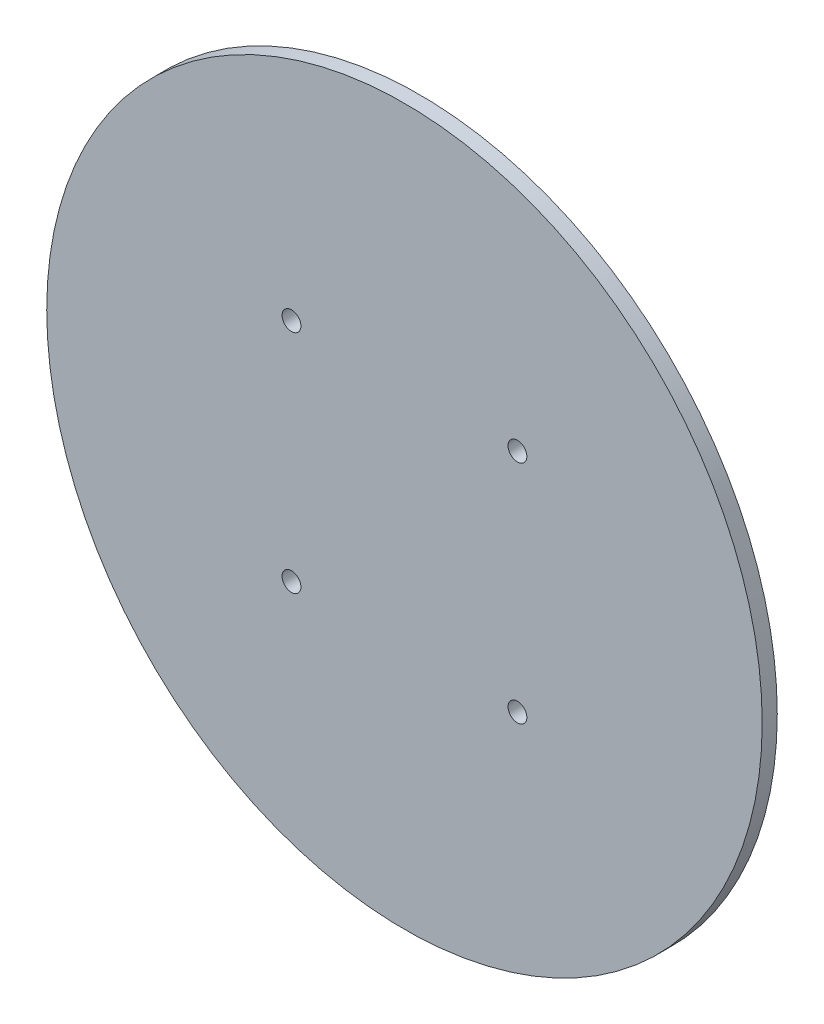
ISO-10303-21;
HEADER;
FILE_DESCRIPTION(('STEP AP214'),'2;1');
FILE_NAME('part.step','',(''),(''),'','','');
FILE_SCHEMA(('AUTOMOTIVE_DESIGN { 1 0 10303 214 1 1 1 1 }'));
ENDSEC;
DATA;
#1=APPLICATION_CONTEXT('core data for automotive mechanical design processes');
#2=APPLICATION_PROTOCOL_DEFINITION('international standard','automotive_design',2000,#1);
#3=PRODUCT_CONTEXT('',#1,'mechanical');
#4=PRODUCT('Part','Part','',(#3));
#5=PRODUCT_RELATED_PRODUCT_CATEGORY('part','',(#4));
#6=PRODUCT_DEFINITION_FORMATION('','',#4);
#7=PRODUCT_DEFINITION_CONTEXT('part definition',#1,'design');
#8=PRODUCT_DEFINITION('design','',#6,#7);
#9=PRODUCT_DEFINITION_SHAPE('','',#8);
#10=(LENGTH_UNIT() NAMED_UNIT(*) SI_UNIT(.MILLI.,.METRE.));
#11=(NAMED_UNIT(*) PLANE_ANGLE_UNIT() SI_UNIT($,.RADIAN.));
#12=(NAMED_UNIT(*) SI_UNIT($,.STERADIAN.) SOLID_ANGLE_UNIT());
#13=UNCERTAINTY_MEASURE_WITH_UNIT(LENGTH_MEASURE(1.E-05),#10,'distance_accuracy_value','');
#14=(GEOMETRIC_REPRESENTATION_CONTEXT(3) GLOBAL_UNCERTAINTY_ASSIGNED_CONTEXT((#13)) GLOBAL_UNIT_ASSIGNED_CONTEXT((#10,
#11,#12)) REPRESENTATION_CONTEXT('',''));
#15=CARTESIAN_POINT('',(0.,0.,0.));
#16=DIRECTION('',(0.,0.,1.));
#17=DIRECTION('',(1.,0.,0.));
#18=AXIS2_PLACEMENT_3D('',#15,#16,#17);
#19=CARTESIAN_POINT('',(0.,0.,4.));
#20=DIRECTION('',(0.,0.,-1.));
#21=DIRECTION('',(-1.,0.,0.));
#22=AXIS2_PLACEMENT_3D('',#19,#20,#21);
#23=CYLINDRICAL_SURFACE('',#22,95.);
#24=CARTESIAN_POINT('',(0.,0.,4.));
#25=DIRECTION('',(0.,0.,1.));
#26=DIRECTION('',(1.,0.,0.));
#27=AXIS2_PLACEMENT_3D('',#24,#25,#26);
#28=CIRCLE('',#27,95.);
#29=CARTESIAN_POINT('',(95.,0.,4.));
#30=VERTEX_POINT('',#29);
#31=EDGE_CURVE('E10',#30,#30,#28,.T.);
#32=ORIENTED_EDGE('',*,*,#31,.F.);
#33=EDGE_LOOP('',(#32));
#34=FACE_BOUND('',#33,.T.);
#35=CARTESIAN_POINT('',(0.,0.,0.));
#36=DIRECTION('',(0.,0.,1.));
#37=DIRECTION('',(1.,0.,0.));
#38=AXIS2_PLACEMENT_3D('',#35,#36,#37);
#39=CIRCLE('',#38,95.);
#40=CARTESIAN_POINT('',(95.,0.,0.));
#41=VERTEX_POINT('',#40);
#42=EDGE_CURVE('E45',#41,#41,#39,.T.);
#43=ORIENTED_EDGE('',*,*,#42,.T.);
#44=EDGE_LOOP('',(#43));
#45=FACE_BOUND('',#44,.T.);
#46=ADVANCED_FACE('F42',(#34,#45),#23,.T.);
#47=CARTESIAN_POINT('',(0.,0.,4.));
#48=DIRECTION('',(0.,0.,1.));
#49=DIRECTION('',(1.,0.,0.));
#50=AXIS2_PLACEMENT_3D('',#47,#48,#49);
#51=PLANE('',#50);
#52=CARTESIAN_POINT('',(30.,30.,4.));
#53=DIRECTION('',(0.,0.,1.));
#54=DIRECTION('',(1.,0.,0.));
#55=AXIS2_PLACEMENT_3D('',#52,#53,#54);
#56=CIRCLE('',#55,2.5);
#57=CARTESIAN_POINT('',(32.5,30.,4.));
#58=VERTEX_POINT('',#57);
#59=EDGE_CURVE('E60',#58,#58,#56,.T.);
#60=ORIENTED_EDGE('',*,*,#59,.F.);
#61=EDGE_LOOP('',(#60));
#62=FACE_BOUND('',#61,.T.);
#63=CARTESIAN_POINT('',(-30.,-30.,4.));
#64=DIRECTION('',(0.,0.,1.));
#65=DIRECTION('',(1.,0.,0.));
#66=AXIS2_PLACEMENT_3D('',#63,#64,#65);
#67=CIRCLE('',#66,2.5);
#68=CARTESIAN_POINT('',(-27.5,-30.,4.));
#69=VERTEX_POINT('',#68);
#70=EDGE_CURVE('E68',#69,#69,#67,.T.);
#71=ORIENTED_EDGE('',*,*,#70,.F.);
#72=EDGE_LOOP('',(#71));
#73=FACE_BOUND('',#72,.T.);
#74=CARTESIAN_POINT('',(30.,-30.,4.));
#75=DIRECTION('',(0.,0.,1.));
#76=DIRECTION('',(1.,0.,0.));
#77=AXIS2_PLACEMENT_3D('',#74,#75,#76);
#78=CIRCLE('',#77,2.5);
#79=CARTESIAN_POINT('',(32.5,-30.,4.));
#80=VERTEX_POINT('',#79);
#81=EDGE_CURVE('E69',#80,#80,#78,.T.);
#82=ORIENTED_EDGE('',*,*,#81,.F.);
#83=EDGE_LOOP('',(#82));
#84=FACE_BOUND('',#83,.T.);
#85=CARTESIAN_POINT('',(-30.,30.,4.));
#86=DIRECTION('',(0.,0.,1.));
#87=DIRECTION('',(1.,0.,0.));
#88=AXIS2_PLACEMENT_3D('',#85,#86,#87);
#89=CIRCLE('',#88,2.5);
#90=CARTESIAN_POINT('',(-27.5,30.,4.));
#91=VERTEX_POINT('',#90);
#92=EDGE_CURVE('E56',#91,#91,#89,.T.);
#93=ORIENTED_EDGE('',*,*,#92,.F.);
#94=EDGE_LOOP('',(#93));
#95=FACE_BOUND('',#94,.T.);
#96=ORIENTED_EDGE('',*,*,#31,.T.);
#97=EDGE_LOOP('',(#96));
#98=FACE_BOUND('',#97,.T.);
#99=ADVANCED_FACE('F90',(#62,#73,#84,#95,#98),#51,.T.);
#100=CARTESIAN_POINT('',(0.,0.,0.));
#101=DIRECTION('',(0.,0.,1.));
#102=DIRECTION('',(1.,0.,0.));
#103=AXIS2_PLACEMENT_3D('',#100,#101,#102);
#104=PLANE('',#103);
#105=CARTESIAN_POINT('',(30.,30.,0.));
#106=DIRECTION('',(0.,0.,1.));
#107=DIRECTION('',(1.,0.,0.));
#108=AXIS2_PLACEMENT_3D('',#105,#106,#107);
#109=CIRCLE('',#108,2.5);
#110=CARTESIAN_POINT('',(32.5,30.,0.));
#111=VERTEX_POINT('',#110);
#112=EDGE_CURVE('E73',#111,#111,#109,.T.);
#113=ORIENTED_EDGE('',*,*,#112,.T.);
#114=EDGE_LOOP('',(#113));
#115=FACE_BOUND('',#114,.T.);
#116=CARTESIAN_POINT('',(-30.,-30.,0.));
#117=DIRECTION('',(0.,0.,1.));
#118=DIRECTION('',(1.,0.,0.));
#119=AXIS2_PLACEMENT_3D('',#116,#117,#118);
#120=CIRCLE('',#119,2.5);
#121=CARTESIAN_POINT('',(-27.5,-30.,0.));
#122=VERTEX_POINT('',#121);
#123=EDGE_CURVE('E64',#122,#122,#120,.T.);
#124=ORIENTED_EDGE('',*,*,#123,.T.);
#125=EDGE_LOOP('',(#124));
#126=FACE_BOUND('',#125,.T.);
#127=CARTESIAN_POINT('',(30.,-30.,0.));
#128=DIRECTION('',(0.,0.,1.));
#129=DIRECTION('',(1.,0.,0.));
#130=AXIS2_PLACEMENT_3D('',#127,#128,#129);
#131=CIRCLE('',#130,2.5);
#132=CARTESIAN_POINT('',(32.5,-30.,0.));
#133=VERTEX_POINT('',#132);
#134=EDGE_CURVE('E80',#133,#133,#131,.T.);
#135=ORIENTED_EDGE('',*,*,#134,.T.);
#136=EDGE_LOOP('',(#135));
#137=FACE_BOUND('',#136,.T.);
#138=CARTESIAN_POINT('',(-30.,30.,0.));
#139=DIRECTION('',(0.,0.,1.));
#140=DIRECTION('',(1.,0.,0.));
#141=AXIS2_PLACEMENT_3D('',#138,#139,#140);
#142=CIRCLE('',#141,2.5);
#143=CARTESIAN_POINT('',(-27.5,30.,0.));
#144=VERTEX_POINT('',#143);
#145=EDGE_CURVE('E54',#144,#144,#142,.T.);
#146=ORIENTED_EDGE('',*,*,#145,.T.);
#147=EDGE_LOOP('',(#146));
#148=FACE_BOUND('',#147,.T.);
#149=ORIENTED_EDGE('',*,*,#42,.F.);
#150=EDGE_LOOP('',(#149));
#151=FACE_BOUND('',#150,.T.);
#152=ADVANCED_FACE('F93',(#115,#126,#137,#148,#151),#104,.F.);
#153=CARTESIAN_POINT('',(-30.,30.,0.));
#154=DIRECTION('',(0.,0.,1.));
#155=DIRECTION('',(1.,0.,0.));
#156=AXIS2_PLACEMENT_3D('',#153,#154,#155);
#157=CYLINDRICAL_SURFACE('',#156,2.5);
#158=ORIENTED_EDGE('',*,*,#145,.F.);
#159=EDGE_LOOP('',(#158));
#160=FACE_BOUND('',#159,.T.);
#161=ORIENTED_EDGE('',*,*,#92,.T.);
#162=EDGE_LOOP('',(#161));
#163=FACE_BOUND('',#162,.T.);
#164=ADVANCED_FACE('F98',(#160,#163),#157,.F.);
#165=CARTESIAN_POINT('',(30.,-30.,0.));
#166=DIRECTION('',(0.,0.,1.));
#167=DIRECTION('',(1.,0.,0.));
#168=AXIS2_PLACEMENT_3D('',#165,#166,#167);
#169=CYLINDRICAL_SURFACE('',#168,2.5);
#170=ORIENTED_EDGE('',*,*,#134,.F.);
#171=EDGE_LOOP('',(#170));
#172=FACE_BOUND('',#171,.T.);
#173=ORIENTED_EDGE('',*,*,#81,.T.);
#174=EDGE_LOOP('',(#173));
#175=FACE_BOUND('',#174,.T.);
#176=ADVANCED_FACE('F88',(#172,#175),#169,.F.);
#177=CARTESIAN_POINT('',(-30.,-30.,0.));
#178=DIRECTION('',(0.,0.,1.));
#179=DIRECTION('',(1.,0.,0.));
#180=AXIS2_PLACEMENT_3D('',#177,#178,#179);
#181=CYLINDRICAL_SURFACE('',#180,2.5);
#182=ORIENTED_EDGE('',*,*,#123,.F.);
#183=EDGE_LOOP('',(#182));
#184=FACE_BOUND('',#183,.T.);
#185=ORIENTED_EDGE('',*,*,#70,.T.);
#186=EDGE_LOOP('',(#185));
#187=FACE_BOUND('',#186,.T.);
#188=ADVANCED_FACE('F106',(#184,#187),#181,.F.);
#189=CARTESIAN_POINT('',(30.,30.,0.));
#190=DIRECTION('',(0.,0.,1.));
#191=DIRECTION('',(1.,0.,0.));
#192=AXIS2_PLACEMENT_3D('',#189,#190,#191);
#193=CYLINDRICAL_SURFACE('',#192,2.5);
#194=ORIENTED_EDGE('',*,*,#112,.F.);
#195=EDGE_LOOP('',(#194));
#196=FACE_BOUND('',#195,.T.);
#197=ORIENTED_EDGE('',*,*,#59,.T.);
#198=EDGE_LOOP('',(#197));
#199=FACE_BOUND('',#198,.T.);
#200=ADVANCED_FACE('F149',(#196,#199),#193,.F.);
#201=CLOSED_SHELL('',(#46,#99,#152,#164,#176,#188,#200));
#202=MANIFOLD_SOLID_BREP('B2',#201);
#203=ADVANCED_BREP_SHAPE_REPRESENTATION('',(#18,#202),#14);
#204=SHAPE_DEFINITION_REPRESENTATION(#9,#203);
ENDSEC;
END-ISO-10303-21;
